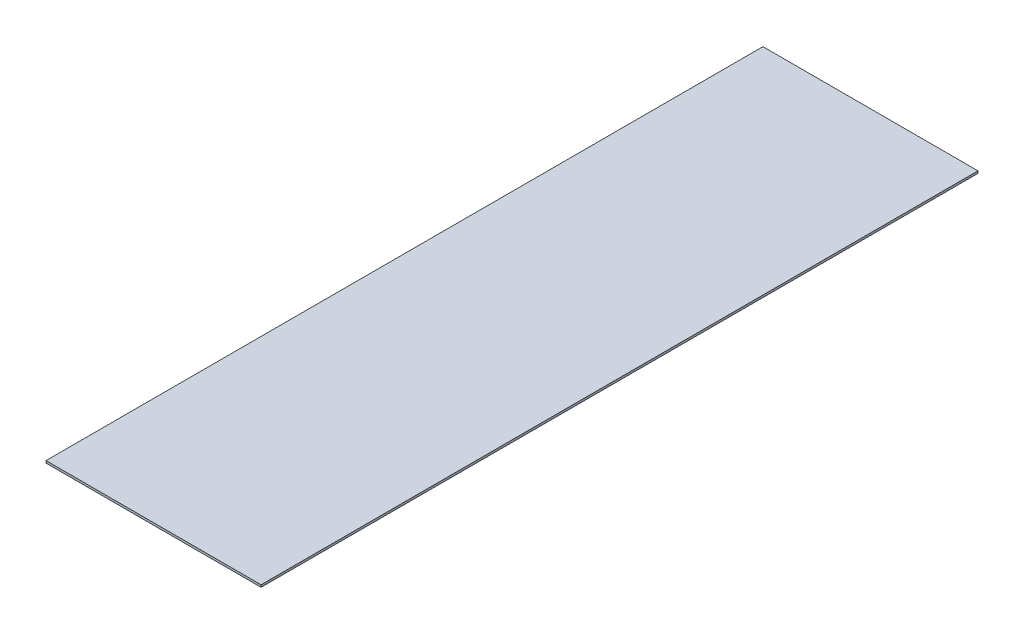
ISO-10303-21;
HEADER;
FILE_DESCRIPTION(('STEP AP214'),'2;1');
FILE_NAME('part.step','',(''),(''),'','','');
FILE_SCHEMA(('AUTOMOTIVE_DESIGN { 1 0 10303 214 1 1 1 1 }'));
ENDSEC;
DATA;
#1=APPLICATION_CONTEXT('core data for automotive mechanical design processes');
#2=APPLICATION_PROTOCOL_DEFINITION('international standard','automotive_design',2000,#1);
#3=PRODUCT_CONTEXT('',#1,'mechanical');
#4=PRODUCT('Part','Part','',(#3));
#5=PRODUCT_RELATED_PRODUCT_CATEGORY('part','',(#4));
#6=PRODUCT_DEFINITION_FORMATION('','',#4);
#7=PRODUCT_DEFINITION_CONTEXT('part definition',#1,'design');
#8=PRODUCT_DEFINITION('design','',#6,#7);
#9=PRODUCT_DEFINITION_SHAPE('','',#8);
#10=(LENGTH_UNIT() NAMED_UNIT(*) SI_UNIT(.MILLI.,.METRE.));
#11=(NAMED_UNIT(*) PLANE_ANGLE_UNIT() SI_UNIT($,.RADIAN.));
#12=(NAMED_UNIT(*) SI_UNIT($,.STERADIAN.) SOLID_ANGLE_UNIT());
#13=UNCERTAINTY_MEASURE_WITH_UNIT(LENGTH_MEASURE(1.E-05),#10,'distance_accuracy_value','');
#14=(GEOMETRIC_REPRESENTATION_CONTEXT(3) GLOBAL_UNCERTAINTY_ASSIGNED_CONTEXT((#13)) GLOBAL_UNIT_ASSIGNED_CONTEXT((#10,
#11,#12)) REPRESENTATION_CONTEXT('',''));
#15=CARTESIAN_POINT('',(0.,0.,0.));
#16=DIRECTION('',(0.,0.,1.));
#17=DIRECTION('',(1.,0.,0.));
#18=AXIS2_PLACEMENT_3D('',#15,#16,#17);
#19=CARTESIAN_POINT('',(457.2,9.5,1524.));
#20=DIRECTION('',(-1.,0.,0.));
#21=DIRECTION('',(0.,0.,1.));
#22=AXIS2_PLACEMENT_3D('',#19,#20,#21);
#23=PLANE('',#22);
#24=DIRECTION('',(0.,0.,-1.));
#25=VECTOR('',#24,1.);
#26=CARTESIAN_POINT('',(457.2,0.,1524.));
#27=LINE('',#26,#25);
#28=CARTESIAN_POINT('',(457.2,0.,1524.));
#29=VERTEX_POINT('',#28);
#30=CARTESIAN_POINT('',(457.2,0.,-1524.));
#31=VERTEX_POINT('',#30);
#32=EDGE_CURVE('E96',#29,#31,#27,.T.);
#33=ORIENTED_EDGE('',*,*,#32,.T.);
#34=DIRECTION('',(0.,-1.,0.));
#35=VECTOR('',#34,1.);
#36=CARTESIAN_POINT('',(457.2,9.5,-1524.));
#37=LINE('',#36,#35);
#38=CARTESIAN_POINT('',(457.2,9.5,-1524.));
#39=VERTEX_POINT('',#38);
#40=EDGE_CURVE('E11',#39,#31,#37,.T.);
#41=ORIENTED_EDGE('',*,*,#40,.F.);
#42=DIRECTION('',(0.,0.,-1.));
#43=VECTOR('',#42,1.);
#44=CARTESIAN_POINT('',(457.2,9.5,1524.));
#45=LINE('',#44,#43);
#46=CARTESIAN_POINT('',(457.2,9.5,1524.));
#47=VERTEX_POINT('',#46);
#48=EDGE_CURVE('E84',#47,#39,#45,.T.);
#49=ORIENTED_EDGE('',*,*,#48,.F.);
#50=DIRECTION('',(0.,-1.,0.));
#51=VECTOR('',#50,1.);
#52=CARTESIAN_POINT('',(457.2,9.5,1524.));
#53=LINE('',#52,#51);
#54=EDGE_CURVE('E92',#47,#29,#53,.T.);
#55=ORIENTED_EDGE('',*,*,#54,.T.);
#56=EDGE_LOOP('',(#33,#41,#49,#55));
#57=FACE_BOUND('',#56,.T.);
#58=ADVANCED_FACE('F33',(#57),#23,.F.);
#59=CARTESIAN_POINT('',(-457.2,9.5,-1524.));
#60=DIRECTION('',(0.,0.,1.));
#61=DIRECTION('',(1.,0.,0.));
#62=AXIS2_PLACEMENT_3D('',#59,#60,#61);
#63=PLANE('',#62);
#64=DIRECTION('',(-1.,0.,0.));
#65=VECTOR('',#64,1.);
#66=CARTESIAN_POINT('',(-457.2,0.,-1524.));
#67=LINE('',#66,#65);
#68=CARTESIAN_POINT('',(-457.2,0.,-1524.));
#69=VERTEX_POINT('',#68);
#70=EDGE_CURVE('E88',#31,#69,#67,.T.);
#71=ORIENTED_EDGE('',*,*,#70,.T.);
#72=DIRECTION('',(0.,-1.,0.));
#73=VECTOR('',#72,1.);
#74=CARTESIAN_POINT('',(-457.2,9.5,-1524.));
#75=LINE('',#74,#73);
#76=CARTESIAN_POINT('',(-457.2,9.5,-1524.));
#77=VERTEX_POINT('',#76);
#78=EDGE_CURVE('E41',#77,#69,#75,.T.);
#79=ORIENTED_EDGE('',*,*,#78,.F.);
#80=DIRECTION('',(-1.,0.,0.));
#81=VECTOR('',#80,1.);
#82=CARTESIAN_POINT('',(-457.2,9.5,-1524.));
#83=LINE('',#82,#81);
#84=EDGE_CURVE('E79',#39,#77,#83,.T.);
#85=ORIENTED_EDGE('',*,*,#84,.F.);
#86=ORIENTED_EDGE('',*,*,#40,.T.);
#87=EDGE_LOOP('',(#71,#79,#85,#86));
#88=FACE_BOUND('',#87,.T.);
#89=ADVANCED_FACE('F87',(#88),#63,.F.);
#90=CARTESIAN_POINT('',(-457.2,9.5,1524.));
#91=DIRECTION('',(1.,0.,0.));
#92=DIRECTION('',(0.,0.,-1.));
#93=AXIS2_PLACEMENT_3D('',#90,#91,#92);
#94=PLANE('',#93);
#95=DIRECTION('',(0.,0.,1.));
#96=VECTOR('',#95,1.);
#97=CARTESIAN_POINT('',(-457.2,0.,1524.));
#98=LINE('',#97,#96);
#99=CARTESIAN_POINT('',(-457.2,0.,1524.));
#100=VERTEX_POINT('',#99);
#101=EDGE_CURVE('E66',#69,#100,#98,.T.);
#102=ORIENTED_EDGE('',*,*,#101,.T.);
#103=DIRECTION('',(0.,-1.,0.));
#104=VECTOR('',#103,1.);
#105=CARTESIAN_POINT('',(-457.2,9.5,1524.));
#106=LINE('',#105,#104);
#107=CARTESIAN_POINT('',(-457.2,9.5,1524.));
#108=VERTEX_POINT('',#107);
#109=EDGE_CURVE('E89',#108,#100,#106,.T.);
#110=ORIENTED_EDGE('',*,*,#109,.F.);
#111=DIRECTION('',(0.,0.,1.));
#112=VECTOR('',#111,1.);
#113=CARTESIAN_POINT('',(-457.2,9.5,1524.));
#114=LINE('',#113,#112);
#115=EDGE_CURVE('E82',#77,#108,#114,.T.);
#116=ORIENTED_EDGE('',*,*,#115,.F.);
#117=ORIENTED_EDGE('',*,*,#78,.T.);
#118=EDGE_LOOP('',(#102,#110,#116,#117));
#119=FACE_BOUND('',#118,.T.);
#120=ADVANCED_FACE('F90',(#119),#94,.F.);
#121=CARTESIAN_POINT('',(-457.2,9.5,1524.));
#122=DIRECTION('',(0.,0.,-1.));
#123=DIRECTION('',(-1.,0.,0.));
#124=AXIS2_PLACEMENT_3D('',#121,#122,#123);
#125=PLANE('',#124);
#126=DIRECTION('',(1.,0.,0.));
#127=VECTOR('',#126,1.);
#128=CARTESIAN_POINT('',(-457.2,0.,1524.));
#129=LINE('',#128,#127);
#130=EDGE_CURVE('E72',#100,#29,#129,.T.);
#131=ORIENTED_EDGE('',*,*,#130,.T.);
#132=ORIENTED_EDGE('',*,*,#54,.F.);
#133=DIRECTION('',(1.,0.,0.));
#134=VECTOR('',#133,1.);
#135=CARTESIAN_POINT('',(-457.2,9.5,1524.));
#136=LINE('',#135,#134);
#137=EDGE_CURVE('E49',#108,#47,#136,.T.);
#138=ORIENTED_EDGE('',*,*,#137,.F.);
#139=ORIENTED_EDGE('',*,*,#109,.T.);
#140=EDGE_LOOP('',(#131,#132,#138,#139));
#141=FACE_BOUND('',#140,.T.);
#142=ADVANCED_FACE('F103',(#141),#125,.F.);
#143=CARTESIAN_POINT('',(0.,9.5,0.));
#144=DIRECTION('',(0.,-1.,0.));
#145=DIRECTION('',(0.,0.,-1.));
#146=AXIS2_PLACEMENT_3D('',#143,#144,#145);
#147=PLANE('',#146);
#148=ORIENTED_EDGE('',*,*,#48,.T.);
#149=ORIENTED_EDGE('',*,*,#84,.T.);
#150=ORIENTED_EDGE('',*,*,#115,.T.);
#151=ORIENTED_EDGE('',*,*,#137,.T.);
#152=EDGE_LOOP('',(#148,#149,#150,#151));
#153=FACE_BOUND('',#152,.T.);
#154=ADVANCED_FACE('F80',(#153),#147,.F.);
#155=CARTESIAN_POINT('',(0.,0.,0.));
#156=DIRECTION('',(0.,-1.,0.));
#157=DIRECTION('',(0.,0.,-1.));
#158=AXIS2_PLACEMENT_3D('',#155,#156,#157);
#159=PLANE('',#158);
#160=ORIENTED_EDGE('',*,*,#32,.F.);
#161=ORIENTED_EDGE('',*,*,#130,.F.);
#162=ORIENTED_EDGE('',*,*,#101,.F.);
#163=ORIENTED_EDGE('',*,*,#70,.F.);
#164=EDGE_LOOP('',(#160,#161,#162,#163));
#165=FACE_BOUND('',#164,.T.);
#166=ADVANCED_FACE('F106',(#165),#159,.T.);
#167=CLOSED_SHELL('',(#58,#89,#120,#142,#154,#166));
#168=MANIFOLD_SOLID_BREP('B2',#167);
#169=ADVANCED_BREP_SHAPE_REPRESENTATION('',(#18,#168),#14);
#170=SHAPE_DEFINITION_REPRESENTATION(#9,#169);
ENDSEC;
END-ISO-10303-21;
